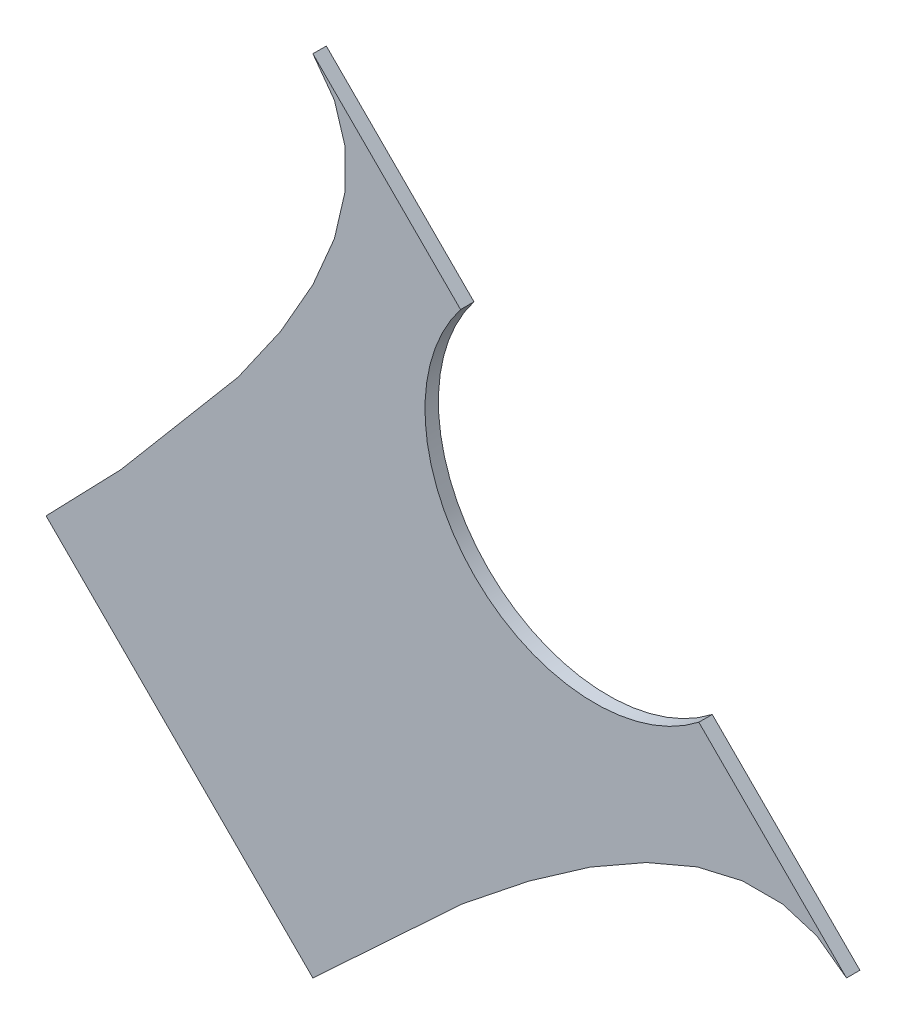
ISO-10303-21;
HEADER;
FILE_DESCRIPTION(('STEP AP214'),'2;1');
FILE_NAME('part.step','',(''),(''),'','','');
FILE_SCHEMA(('AUTOMOTIVE_DESIGN { 1 0 10303 214 1 1 1 1 }'));
ENDSEC;
DATA;
#1=APPLICATION_CONTEXT('core data for automotive mechanical design processes');
#2=APPLICATION_PROTOCOL_DEFINITION('international standard','automotive_design',2000,#1);
#3=PRODUCT_CONTEXT('',#1,'mechanical');
#4=PRODUCT('Part','Part','',(#3));
#5=PRODUCT_RELATED_PRODUCT_CATEGORY('part','',(#4));
#6=PRODUCT_DEFINITION_FORMATION('','',#4);
#7=PRODUCT_DEFINITION_CONTEXT('part definition',#1,'design');
#8=PRODUCT_DEFINITION('design','',#6,#7);
#9=PRODUCT_DEFINITION_SHAPE('','',#8);
#10=(LENGTH_UNIT() NAMED_UNIT(*) SI_UNIT(.MILLI.,.METRE.));
#11=(NAMED_UNIT(*) PLANE_ANGLE_UNIT() SI_UNIT($,.RADIAN.));
#12=(NAMED_UNIT(*) SI_UNIT($,.STERADIAN.) SOLID_ANGLE_UNIT());
#13=UNCERTAINTY_MEASURE_WITH_UNIT(LENGTH_MEASURE(1.E-05),#10,'distance_accuracy_value','');
#14=(GEOMETRIC_REPRESENTATION_CONTEXT(3) GLOBAL_UNCERTAINTY_ASSIGNED_CONTEXT((#13)) GLOBAL_UNIT_ASSIGNED_CONTEXT((#10,
#11,#12)) REPRESENTATION_CONTEXT('',''));
#15=CARTESIAN_POINT('',(0.,0.,0.));
#16=DIRECTION('',(0.,0.,1.));
#17=DIRECTION('',(1.,0.,0.));
#18=AXIS2_PLACEMENT_3D('',#15,#16,#17);
#19=CARTESIAN_POINT('',(46.6570014953613,116.28099822998,0.));
#20=DIRECTION('',(0.707108688823852,0.707104873544097,0.));
#21=DIRECTION('',(0.707104873544097,-0.707108688823852,0.));
#22=AXIS2_PLACEMENT_3D('',#19,#20,#21);
#23=PLANE('',#22);
#24=DIRECTION('',(0.707104873544096,-0.707108688823852,0.));
#25=VECTOR('',#24,1.);
#26=CARTESIAN_POINT('',(46.6570014953613,116.28099822998,0.03556));
#27=LINE('',#26,#25);
#28=CARTESIAN_POINT('',(46.6570014953613,116.28099822998,0.03556));
#29=VERTEX_POINT('',#28);
#30=CARTESIAN_POINT('',(47.3639984130859,115.573997497559,0.03556));
#31=VERTEX_POINT('',#30);
#32=EDGE_CURVE('E11',#29,#31,#27,.T.);
#33=ORIENTED_EDGE('',*,*,#32,.F.);
#34=DIRECTION('',(0.,0.,1.));
#35=VECTOR('',#34,1.);
#36=CARTESIAN_POINT('',(46.6570014953613,116.28099822998,0.));
#37=LINE('',#36,#35);
#38=CARTESIAN_POINT('',(46.6570014953613,116.28099822998,0.));
#39=VERTEX_POINT('',#38);
#40=EDGE_CURVE('E24',#39,#29,#37,.T.);
#41=ORIENTED_EDGE('',*,*,#40,.F.);
#42=DIRECTION('',(0.707104873544096,-0.707108688823852,0.));
#43=VECTOR('',#42,1.);
#44=CARTESIAN_POINT('',(46.6570014953613,116.28099822998,0.));
#45=LINE('',#44,#43);
#46=CARTESIAN_POINT('',(47.3639984130859,115.573997497559,0.));
#47=VERTEX_POINT('',#46);
#48=EDGE_CURVE('E339',#39,#47,#45,.T.);
#49=ORIENTED_EDGE('',*,*,#48,.T.);
#50=DIRECTION('',(0.,0.,1.));
#51=VECTOR('',#50,1.);
#52=CARTESIAN_POINT('',(47.3639984130859,115.573997497559,0.));
#53=LINE('',#52,#51);
#54=EDGE_CURVE('E37',#47,#31,#53,.T.);
#55=ORIENTED_EDGE('',*,*,#54,.T.);
#56=EDGE_LOOP('',(#33,#41,#49,#55));
#57=FACE_BOUND('',#56,.T.);
#58=ADVANCED_FACE('F17',(#57),#23,.F.);
#59=CARTESIAN_POINT('',(46.8549995422363,116.486000061035,0.));
#60=DIRECTION('',(0.71928706010628,-0.694712980419731,0.));
#61=DIRECTION('',(-0.694712980419731,-0.71928706010628,0.));
#62=AXIS2_PLACEMENT_3D('',#59,#60,#61);
#63=PLANE('',#62);
#64=DIRECTION('',(-0.694712980419731,-0.71928706010628,0.));
#65=VECTOR('',#64,1.);
#66=CARTESIAN_POINT('',(46.8549995422363,116.486000061035,0.03556));
#67=LINE('',#66,#65);
#68=CARTESIAN_POINT('',(46.8549995422363,116.486000061035,0.03556));
#69=VERTEX_POINT('',#68);
#70=EDGE_CURVE('E335',#69,#29,#67,.T.);
#71=ORIENTED_EDGE('',*,*,#70,.F.);
#72=DIRECTION('',(0.,0.,1.));
#73=VECTOR('',#72,1.);
#74=CARTESIAN_POINT('',(46.8549995422363,116.486000061035,0.));
#75=LINE('',#74,#73);
#76=CARTESIAN_POINT('',(46.8549995422363,116.486000061035,0.));
#77=VERTEX_POINT('',#76);
#78=EDGE_CURVE('E333',#77,#69,#75,.T.);
#79=ORIENTED_EDGE('',*,*,#78,.F.);
#80=DIRECTION('',(-0.694712980419731,-0.71928706010628,0.));
#81=VECTOR('',#80,1.);
#82=CARTESIAN_POINT('',(46.8549995422363,116.486000061035,0.));
#83=LINE('',#82,#81);
#84=EDGE_CURVE('E331',#77,#39,#83,.T.);
#85=ORIENTED_EDGE('',*,*,#84,.T.);
#86=ORIENTED_EDGE('',*,*,#40,.T.);
#87=EDGE_LOOP('',(#71,#79,#85,#86));
#88=FACE_BOUND('',#87,.T.);
#89=ADVANCED_FACE('F342',(#88),#63,.F.);
#90=CARTESIAN_POINT('',(47.1660003662109,116.853996276855,0.));
#91=DIRECTION('',(0.763775655311876,-0.645481795524022,0.));
#92=DIRECTION('',(-0.645481795524022,-0.763775655311876,0.));
#93=AXIS2_PLACEMENT_3D('',#90,#91,#92);
#94=PLANE('',#93);
#95=DIRECTION('',(-0.645481795524022,-0.763775655311876,0.));
#96=VECTOR('',#95,1.);
#97=CARTESIAN_POINT('',(47.1660003662109,116.853996276855,0.03556));
#98=LINE('',#97,#96);
#99=CARTESIAN_POINT('',(47.1660003662109,116.853996276855,0.03556));
#100=VERTEX_POINT('',#99);
#101=EDGE_CURVE('E328',#100,#69,#98,.T.);
#102=ORIENTED_EDGE('',*,*,#101,.F.);
#103=DIRECTION('',(0.,0.,1.));
#104=VECTOR('',#103,1.);
#105=CARTESIAN_POINT('',(47.1660003662109,116.853996276855,0.));
#106=LINE('',#105,#104);
#107=CARTESIAN_POINT('',(47.1660003662109,116.853996276855,0.));
#108=VERTEX_POINT('',#107);
#109=EDGE_CURVE('E326',#108,#100,#106,.T.);
#110=ORIENTED_EDGE('',*,*,#109,.F.);
#111=DIRECTION('',(-0.645481795524022,-0.763775655311876,0.));
#112=VECTOR('',#111,1.);
#113=CARTESIAN_POINT('',(47.1660003662109,116.853996276855,0.));
#114=LINE('',#113,#112);
#115=EDGE_CURVE('E323',#108,#77,#114,.T.);
#116=ORIENTED_EDGE('',*,*,#115,.T.);
#117=ORIENTED_EDGE('',*,*,#78,.T.);
#118=EDGE_LOOP('',(#102,#110,#116,#117));
#119=FACE_BOUND('',#118,.T.);
#120=ADVANCED_FACE('F345',(#119),#94,.F.);
#121=CARTESIAN_POINT('',(47.2789993286133,117.015998840332,0.));
#122=DIRECTION('',(0.820188914417434,-0.572092776275624,0.));
#123=DIRECTION('',(-0.572092776275624,-0.820188914417434,0.));
#124=AXIS2_PLACEMENT_3D('',#121,#122,#123);
#125=PLANE('',#124);
#126=DIRECTION('',(-0.572092776275624,-0.820188914417434,0.));
#127=VECTOR('',#126,1.);
#128=CARTESIAN_POINT('',(47.2789993286133,117.015998840332,0.03556));
#129=LINE('',#128,#127);
#130=CARTESIAN_POINT('',(47.2789993286133,117.015998840332,0.03556));
#131=VERTEX_POINT('',#130);
#132=EDGE_CURVE('E320',#131,#100,#129,.T.);
#133=ORIENTED_EDGE('',*,*,#132,.F.);
#134=DIRECTION('',(0.,0.,1.));
#135=VECTOR('',#134,1.);
#136=CARTESIAN_POINT('',(47.2789993286133,117.015998840332,0.));
#137=LINE('',#136,#135);
#138=CARTESIAN_POINT('',(47.2789993286133,117.015998840332,0.));
#139=VERTEX_POINT('',#138);
#140=EDGE_CURVE('E318',#139,#131,#137,.T.);
#141=ORIENTED_EDGE('',*,*,#140,.F.);
#142=DIRECTION('',(-0.572092776275624,-0.820188914417434,0.));
#143=VECTOR('',#142,1.);
#144=CARTESIAN_POINT('',(47.2789993286133,117.015998840332,0.));
#145=LINE('',#144,#143);
#146=EDGE_CURVE('E315',#139,#108,#145,.T.);
#147=ORIENTED_EDGE('',*,*,#146,.T.);
#148=ORIENTED_EDGE('',*,*,#109,.T.);
#149=EDGE_LOOP('',(#133,#141,#147,#148));
#150=FACE_BOUND('',#149,.T.);
#151=ADVANCED_FACE('F350',(#150),#125,.F.);
#152=CARTESIAN_POINT('',(47.3639984130859,117.165000915527,0.));
#153=DIRECTION('',(0.868606923465397,-0.495501778511418,0.));
#154=DIRECTION('',(-0.495501778511418,-0.868606923465397,0.));
#155=AXIS2_PLACEMENT_3D('',#152,#153,#154);
#156=PLANE('',#155);
#157=DIRECTION('',(-0.495501778511418,-0.868606923465397,0.));
#158=VECTOR('',#157,1.);
#159=CARTESIAN_POINT('',(47.3639984130859,117.165000915527,0.03556));
#160=LINE('',#159,#158);
#161=CARTESIAN_POINT('',(47.3639984130859,117.165000915527,0.03556));
#162=VERTEX_POINT('',#161);
#163=EDGE_CURVE('E312',#162,#131,#160,.T.);
#164=ORIENTED_EDGE('',*,*,#163,.F.);
#165=DIRECTION('',(0.,0.,1.));
#166=VECTOR('',#165,1.);
#167=CARTESIAN_POINT('',(47.3639984130859,117.165000915527,0.));
#168=LINE('',#167,#166);
#169=CARTESIAN_POINT('',(47.3639984130859,117.165000915527,0.));
#170=VERTEX_POINT('',#169);
#171=EDGE_CURVE('E310',#170,#162,#168,.T.);
#172=ORIENTED_EDGE('',*,*,#171,.F.);
#173=DIRECTION('',(-0.495501778511418,-0.868606923465397,0.));
#174=VECTOR('',#173,1.);
#175=CARTESIAN_POINT('',(47.3639984130859,117.165000915527,0.));
#176=LINE('',#175,#174);
#177=EDGE_CURVE('E307',#170,#139,#176,.T.);
#178=ORIENTED_EDGE('',*,*,#177,.T.);
#179=ORIENTED_EDGE('',*,*,#140,.T.);
#180=EDGE_LOOP('',(#164,#172,#178,#179));
#181=FACE_BOUND('',#180,.T.);
#182=ADVANCED_FACE('F353',(#181),#156,.F.);
#183=CARTESIAN_POINT('',(47.4210014343262,117.299003601074,0.));
#184=DIRECTION('',(0.920202622375273,-0.391442376057666,0.));
#185=DIRECTION('',(-0.391442376057666,-0.920202622375273,0.));
#186=AXIS2_PLACEMENT_3D('',#183,#184,#185);
#187=PLANE('',#186);
#188=DIRECTION('',(-0.391442376057666,-0.920202622375273,0.));
#189=VECTOR('',#188,1.);
#190=CARTESIAN_POINT('',(47.4210014343262,117.299003601074,0.03556));
#191=LINE('',#190,#189);
#192=CARTESIAN_POINT('',(47.4210014343262,117.299003601074,0.03556));
#193=VERTEX_POINT('',#192);
#194=EDGE_CURVE('E304',#193,#162,#191,.T.);
#195=ORIENTED_EDGE('',*,*,#194,.F.);
#196=DIRECTION('',(0.,0.,1.));
#197=VECTOR('',#196,1.);
#198=CARTESIAN_POINT('',(47.4210014343262,117.299003601074,0.));
#199=LINE('',#198,#197);
#200=CARTESIAN_POINT('',(47.4210014343262,117.299003601074,0.));
#201=VERTEX_POINT('',#200);
#202=EDGE_CURVE('E302',#201,#193,#199,.T.);
#203=ORIENTED_EDGE('',*,*,#202,.F.);
#204=DIRECTION('',(-0.391442376057666,-0.920202622375273,0.));
#205=VECTOR('',#204,1.);
#206=CARTESIAN_POINT('',(47.4210014343262,117.299003601074,0.));
#207=LINE('',#206,#205);
#208=EDGE_CURVE('E299',#201,#170,#207,.T.);
#209=ORIENTED_EDGE('',*,*,#208,.T.);
#210=ORIENTED_EDGE('',*,*,#171,.T.);
#211=EDGE_LOOP('',(#195,#203,#209,#210));
#212=FACE_BOUND('',#211,.T.);
#213=ADVANCED_FACE('F358',(#212),#187,.F.);
#214=CARTESIAN_POINT('',(47.4490013122559,117.419998168945,0.));
#215=DIRECTION('',(0.974253308207898,-0.225456185202282,0.));
#216=DIRECTION('',(-0.225456185202282,-0.974253308207898,0.));
#217=AXIS2_PLACEMENT_3D('',#214,#215,#216);
#218=PLANE('',#217);
#219=DIRECTION('',(-0.225456185202282,-0.974253308207898,0.));
#220=VECTOR('',#219,1.);
#221=CARTESIAN_POINT('',(47.4490013122559,117.419998168945,0.03556));
#222=LINE('',#221,#220);
#223=CARTESIAN_POINT('',(47.4490013122559,117.419998168945,0.03556));
#224=VERTEX_POINT('',#223);
#225=EDGE_CURVE('E296',#224,#193,#222,.T.);
#226=ORIENTED_EDGE('',*,*,#225,.F.);
#227=DIRECTION('',(0.,0.,1.));
#228=VECTOR('',#227,1.);
#229=CARTESIAN_POINT('',(47.4490013122559,117.419998168945,0.));
#230=LINE('',#229,#228);
#231=CARTESIAN_POINT('',(47.4490013122559,117.419998168945,0.));
#232=VERTEX_POINT('',#231);
#233=EDGE_CURVE('E294',#232,#224,#230,.T.);
#234=ORIENTED_EDGE('',*,*,#233,.F.);
#235=DIRECTION('',(-0.225456185202282,-0.974253308207898,0.));
#236=VECTOR('',#235,1.);
#237=CARTESIAN_POINT('',(47.4490013122559,117.419998168945,0.));
#238=LINE('',#237,#236);
#239=EDGE_CURVE('E291',#232,#201,#238,.T.);
#240=ORIENTED_EDGE('',*,*,#239,.T.);
#241=ORIENTED_EDGE('',*,*,#202,.T.);
#242=EDGE_LOOP('',(#226,#234,#240,#241));
#243=FACE_BOUND('',#242,.T.);
#244=ADVANCED_FACE('F361',(#243),#218,.F.);
#245=CARTESIAN_POINT('',(47.4490013122559,117.526000976562,0.));
#246=DIRECTION('',(1.,0.,0.));
#247=DIRECTION('',(0.,-1.,0.));
#248=AXIS2_PLACEMENT_3D('',#245,#246,#247);
#249=PLANE('',#248);
#250=DIRECTION('',(0.,-1.,0.));
#251=VECTOR('',#250,1.);
#252=CARTESIAN_POINT('',(47.4490013122559,117.526000976562,0.03556));
#253=LINE('',#252,#251);
#254=CARTESIAN_POINT('',(47.4490013122559,117.526000976562,0.03556));
#255=VERTEX_POINT('',#254);
#256=EDGE_CURVE('E288',#255,#224,#253,.T.);
#257=ORIENTED_EDGE('',*,*,#256,.F.);
#258=DIRECTION('',(0.,0.,1.));
#259=VECTOR('',#258,1.);
#260=CARTESIAN_POINT('',(47.4490013122559,117.526000976562,0.));
#261=LINE('',#260,#259);
#262=CARTESIAN_POINT('',(47.4490013122559,117.526000976562,0.));
#263=VERTEX_POINT('',#262);
#264=EDGE_CURVE('E286',#263,#255,#261,.T.);
#265=ORIENTED_EDGE('',*,*,#264,.F.);
#266=DIRECTION('',(0.,-1.,0.));
#267=VECTOR('',#266,1.);
#268=CARTESIAN_POINT('',(47.4490013122559,117.526000976562,0.));
#269=LINE('',#268,#267);
#270=EDGE_CURVE('E283',#263,#232,#269,.T.);
#271=ORIENTED_EDGE('',*,*,#270,.T.);
#272=ORIENTED_EDGE('',*,*,#233,.T.);
#273=EDGE_LOOP('',(#257,#265,#271,#272));
#274=FACE_BOUND('',#273,.T.);
#275=ADVANCED_FACE('F366',(#274),#249,.F.);
#276=CARTESIAN_POINT('',(47.4210014343262,117.616996765137,0.));
#277=DIRECTION('',(0.955775543338726,0.294097111096934,0.));
#278=DIRECTION('',(0.294097111096934,-0.955775543338726,0.));
#279=AXIS2_PLACEMENT_3D('',#276,#277,#278);
#280=PLANE('',#279);
#281=DIRECTION('',(0.294097111096934,-0.955775543338726,0.));
#282=VECTOR('',#281,1.);
#283=CARTESIAN_POINT('',(47.4210014343262,117.616996765137,0.03556));
#284=LINE('',#283,#282);
#285=CARTESIAN_POINT('',(47.4210014343262,117.616996765137,0.03556));
#286=VERTEX_POINT('',#285);
#287=EDGE_CURVE('E280',#286,#255,#284,.T.);
#288=ORIENTED_EDGE('',*,*,#287,.F.);
#289=DIRECTION('',(0.,0.,1.));
#290=VECTOR('',#289,1.);
#291=CARTESIAN_POINT('',(47.4210014343262,117.616996765137,0.));
#292=LINE('',#291,#290);
#293=CARTESIAN_POINT('',(47.4210014343262,117.616996765137,0.));
#294=VERTEX_POINT('',#293);
#295=EDGE_CURVE('E278',#294,#286,#292,.T.);
#296=ORIENTED_EDGE('',*,*,#295,.F.);
#297=DIRECTION('',(0.294097111096934,-0.955775543338726,0.));
#298=VECTOR('',#297,1.);
#299=CARTESIAN_POINT('',(47.4210014343262,117.616996765137,0.));
#300=LINE('',#299,#298);
#301=EDGE_CURVE('E275',#294,#263,#300,.T.);
#302=ORIENTED_EDGE('',*,*,#301,.T.);
#303=ORIENTED_EDGE('',*,*,#264,.T.);
#304=EDGE_LOOP('',(#288,#296,#302,#303));
#305=FACE_BOUND('',#304,.T.);
#306=ADVANCED_FACE('F369',(#305),#280,.F.);
#307=CARTESIAN_POINT('',(47.3639984130859,117.694999694824,0.));
#308=DIRECTION('',(0.807386781564813,0.590022529192244,0.));
#309=DIRECTION('',(0.590022529192244,-0.807386781564813,0.));
#310=AXIS2_PLACEMENT_3D('',#307,#308,#309);
#311=PLANE('',#310);
#312=DIRECTION('',(0.590022529192244,-0.807386781564813,0.));
#313=VECTOR('',#312,1.);
#314=CARTESIAN_POINT('',(47.3639984130859,117.694999694824,0.03556));
#315=LINE('',#314,#313);
#316=CARTESIAN_POINT('',(47.3639984130859,117.694999694824,0.03556));
#317=VERTEX_POINT('',#316);
#318=EDGE_CURVE('E272',#317,#286,#315,.T.);
#319=ORIENTED_EDGE('',*,*,#318,.F.);
#320=DIRECTION('',(0.,0.,1.));
#321=VECTOR('',#320,1.);
#322=CARTESIAN_POINT('',(47.3639984130859,117.694999694824,0.));
#323=LINE('',#322,#321);
#324=CARTESIAN_POINT('',(47.3639984130859,117.694999694824,0.));
#325=VERTEX_POINT('',#324);
#326=EDGE_CURVE('E270',#325,#317,#323,.T.);
#327=ORIENTED_EDGE('',*,*,#326,.F.);
#328=DIRECTION('',(0.590022529192244,-0.807386781564813,0.));
#329=VECTOR('',#328,1.);
#330=CARTESIAN_POINT('',(47.3639984130859,117.694999694824,0.));
#331=LINE('',#330,#329);
#332=EDGE_CURVE('E267',#325,#294,#331,.T.);
#333=ORIENTED_EDGE('',*,*,#332,.T.);
#334=ORIENTED_EDGE('',*,*,#295,.T.);
#335=EDGE_LOOP('',(#319,#327,#333,#334));
#336=FACE_BOUND('',#335,.T.);
#337=ADVANCED_FACE('F374',(#336),#311,.F.);
#338=CARTESIAN_POINT('',(47.7553232454057,117.303674862504,0.));
#339=DIRECTION('',(-0.707106781186548,-0.707106781186548,0.));
#340=DIRECTION('',(-0.707106781186548,0.707106781186548,0.));
#341=AXIS2_PLACEMENT_3D('',#338,#339,#340);
#342=PLANE('',#341);
#343=DIRECTION('',(-0.707106781186548,0.707106781186548,0.));
#344=VECTOR('',#343,1.);
#345=CARTESIAN_POINT('',(48.7779998779297,116.28099822998,0.03556));
#346=LINE('',#345,#344);
#347=CARTESIAN_POINT('',(47.7553232454057,117.303674862504,0.03556));
#348=VERTEX_POINT('',#347);
#349=EDGE_CURVE('E264',#348,#317,#346,.T.);
#350=ORIENTED_EDGE('',*,*,#349,.F.);
#351=DIRECTION('',(0.,0.,1.));
#352=VECTOR('',#351,1.);
#353=CARTESIAN_POINT('',(47.7553232454057,117.303674862504,0.));
#354=LINE('',#353,#352);
#355=CARTESIAN_POINT('',(47.7553232454057,117.303674862504,0.));
#356=VERTEX_POINT('',#355);
#357=EDGE_CURVE('E262',#356,#348,#354,.T.);
#358=ORIENTED_EDGE('',*,*,#357,.F.);
#359=DIRECTION('',(-0.707106781186548,0.707106781186548,0.));
#360=VECTOR('',#359,1.);
#361=CARTESIAN_POINT('',(48.7779998779297,116.28099822998,0.));
#362=LINE('',#361,#360);
#363=EDGE_CURVE('E259',#356,#325,#362,.T.);
#364=ORIENTED_EDGE('',*,*,#363,.T.);
#365=ORIENTED_EDGE('',*,*,#326,.T.);
#366=EDGE_LOOP('',(#350,#358,#364,#365));
#367=FACE_BOUND('',#366,.T.);
#368=ADVANCED_FACE('F377',(#367),#342,.F.);
#369=CARTESIAN_POINT('',(48.1110036,117.0280108,0.));
#370=DIRECTION('',(0.,0.,-1.));
#371=DIRECTION('',(1.,0.,0.));
#372=AXIS2_PLACEMENT_3D('',#369,#370,#371);
#373=CYLINDRICAL_SURFACE('',#372,0.4499991);
#374=ORIENTED_EDGE('',*,*,#357,.T.);
#375=CARTESIAN_POINT('',(48.1110036,117.0280108,0.03556));
#376=DIRECTION('',(0.,0.,1.));
#377=DIRECTION('',(1.,0.,0.));
#378=AXIS2_PLACEMENT_3D('',#375,#376,#377);
#379=CIRCLE('',#378,0.4499991);
#380=CARTESIAN_POINT('',(48.3866676625045,116.672330445406,0.03556));
#381=VERTEX_POINT('',#380);
#382=EDGE_CURVE('E256',#348,#381,#379,.T.);
#383=ORIENTED_EDGE('',*,*,#382,.T.);
#384=DIRECTION('',(0.,0.,1.));
#385=VECTOR('',#384,1.);
#386=CARTESIAN_POINT('',(48.3866676625045,116.672330445406,0.));
#387=LINE('',#386,#385);
#388=CARTESIAN_POINT('',(48.3866676625045,116.672330445406,0.));
#389=VERTEX_POINT('',#388);
#390=EDGE_CURVE('E254',#389,#381,#387,.T.);
#391=ORIENTED_EDGE('',*,*,#390,.F.);
#392=CARTESIAN_POINT('',(48.1110036,117.0280108,0.));
#393=DIRECTION('',(0.,0.,1.));
#394=DIRECTION('',(1.,0.,0.));
#395=AXIS2_PLACEMENT_3D('',#392,#393,#394);
#396=CIRCLE('',#395,0.4499991);
#397=EDGE_CURVE('E251',#356,#389,#396,.T.);
#398=ORIENTED_EDGE('',*,*,#397,.F.);
#399=EDGE_LOOP('',(#374,#383,#391,#398));
#400=FACE_BOUND('',#399,.T.);
#401=ADVANCED_FACE('F383',(#400),#373,.F.);
#402=CARTESIAN_POINT('',(48.7779998779297,116.28099822998,0.));
#403=DIRECTION('',(-0.707106781186548,-0.707106781186548,0.));
#404=DIRECTION('',(-0.707106781186548,0.707106781186548,0.));
#405=AXIS2_PLACEMENT_3D('',#402,#403,#404);
#406=PLANE('',#405);
#407=DIRECTION('',(-0.707106781186548,0.707106781186548,0.));
#408=VECTOR('',#407,1.);
#409=CARTESIAN_POINT('',(48.7779998779297,116.28099822998,0.03556));
#410=LINE('',#409,#408);
#411=CARTESIAN_POINT('',(48.7779998779297,116.28099822998,0.03556));
#412=VERTEX_POINT('',#411);
#413=EDGE_CURVE('E248',#412,#381,#410,.T.);
#414=ORIENTED_EDGE('',*,*,#413,.F.);
#415=DIRECTION('',(0.,0.,1.));
#416=VECTOR('',#415,1.);
#417=CARTESIAN_POINT('',(48.7779998779297,116.28099822998,0.));
#418=LINE('',#417,#416);
#419=CARTESIAN_POINT('',(48.7779998779297,116.28099822998,0.));
#420=VERTEX_POINT('',#419);
#421=EDGE_CURVE('E246',#420,#412,#418,.T.);
#422=ORIENTED_EDGE('',*,*,#421,.F.);
#423=EDGE_CURVE('E245',#420,#389,#362,.T.);
#424=ORIENTED_EDGE('',*,*,#423,.T.);
#425=ORIENTED_EDGE('',*,*,#390,.T.);
#426=EDGE_LOOP('',(#414,#422,#424,#425));
#427=FACE_BOUND('',#426,.T.);
#428=ADVANCED_FACE('F386',(#427),#406,.F.);
#429=CARTESIAN_POINT('',(48.7000007629395,116.337997436523,0.));
#430=DIRECTION('',(0.59001559930959,0.807391845742416,0.));
#431=DIRECTION('',(0.807391845742416,-0.59001559930959,0.));
#432=AXIS2_PLACEMENT_3D('',#429,#430,#431);
#433=PLANE('',#432);
#434=DIRECTION('',(0.807391845742416,-0.59001559930959,0.));
#435=VECTOR('',#434,1.);
#436=CARTESIAN_POINT('',(48.7000007629395,116.337997436523,0.03556));
#437=LINE('',#436,#435);
#438=CARTESIAN_POINT('',(48.7000007629395,116.337997436523,0.03556));
#439=VERTEX_POINT('',#438);
#440=EDGE_CURVE('E242',#439,#412,#437,.T.);
#441=ORIENTED_EDGE('',*,*,#440,.F.);
#442=DIRECTION('',(0.,0.,1.));
#443=VECTOR('',#442,1.);
#444=CARTESIAN_POINT('',(48.7000007629395,116.337997436523,0.));
#445=LINE('',#444,#443);
#446=CARTESIAN_POINT('',(48.7000007629395,116.337997436523,0.));
#447=VERTEX_POINT('',#446);
#448=EDGE_CURVE('E240',#447,#439,#445,.T.);
#449=ORIENTED_EDGE('',*,*,#448,.F.);
#450=DIRECTION('',(0.807391845742416,-0.59001559930959,0.));
#451=VECTOR('',#450,1.);
#452=CARTESIAN_POINT('',(48.7000007629395,116.337997436523,0.));
#453=LINE('',#452,#451);
#454=EDGE_CURVE('E237',#447,#420,#453,.T.);
#455=ORIENTED_EDGE('',*,*,#454,.T.);
#456=ORIENTED_EDGE('',*,*,#421,.T.);
#457=EDGE_LOOP('',(#441,#449,#455,#456));
#458=FACE_BOUND('',#457,.T.);
#459=ADVANCED_FACE('F391',(#458),#433,.F.);
#460=CARTESIAN_POINT('',(48.609001159668,116.365997314453,0.));
#461=DIRECTION('',(0.294085848837523,0.95577900872195,0.));
#462=DIRECTION('',(0.95577900872195,-0.294085848837523,0.));
#463=AXIS2_PLACEMENT_3D('',#460,#461,#462);
#464=PLANE('',#463);
#465=DIRECTION('',(0.95577900872195,-0.294085848837523,0.));
#466=VECTOR('',#465,1.);
#467=CARTESIAN_POINT('',(48.609001159668,116.365997314453,0.03556));
#468=LINE('',#467,#466);
#469=CARTESIAN_POINT('',(48.609001159668,116.365997314453,0.03556));
#470=VERTEX_POINT('',#469);
#471=EDGE_CURVE('E234',#470,#439,#468,.T.);
#472=ORIENTED_EDGE('',*,*,#471,.F.);
#473=DIRECTION('',(0.,0.,1.));
#474=VECTOR('',#473,1.);
#475=CARTESIAN_POINT('',(48.609001159668,116.365997314453,0.));
#476=LINE('',#475,#474);
#477=CARTESIAN_POINT('',(48.609001159668,116.365997314453,0.));
#478=VERTEX_POINT('',#477);
#479=EDGE_CURVE('E232',#478,#470,#476,.T.);
#480=ORIENTED_EDGE('',*,*,#479,.F.);
#481=DIRECTION('',(0.95577900872195,-0.294085848837523,0.));
#482=VECTOR('',#481,1.);
#483=CARTESIAN_POINT('',(48.609001159668,116.365997314453,0.));
#484=LINE('',#483,#482);
#485=EDGE_CURVE('E229',#478,#447,#484,.T.);
#486=ORIENTED_EDGE('',*,*,#485,.T.);
#487=ORIENTED_EDGE('',*,*,#448,.T.);
#488=EDGE_LOOP('',(#472,#480,#486,#487));
#489=FACE_BOUND('',#488,.T.);
#490=ADVANCED_FACE('F394',(#489),#464,.F.);
#491=CARTESIAN_POINT('',(48.5019989013672,116.365997314453,0.));
#492=DIRECTION('',(0.,1.,0.));
#493=DIRECTION('',(1.,0.,0.));
#494=AXIS2_PLACEMENT_3D('',#491,#492,#493);
#495=PLANE('',#494);
#496=DIRECTION('',(1.,0.,0.));
#497=VECTOR('',#496,1.);
#498=CARTESIAN_POINT('',(48.5019989013672,116.365997314453,0.03556));
#499=LINE('',#498,#497);
#500=CARTESIAN_POINT('',(48.5019989013672,116.365997314453,0.03556));
#501=VERTEX_POINT('',#500);
#502=EDGE_CURVE('E226',#501,#470,#499,.T.);
#503=ORIENTED_EDGE('',*,*,#502,.F.);
#504=DIRECTION('',(0.,0.,1.));
#505=VECTOR('',#504,1.);
#506=CARTESIAN_POINT('',(48.5019989013672,116.365997314453,0.));
#507=LINE('',#506,#505);
#508=CARTESIAN_POINT('',(48.5019989013672,116.365997314453,0.));
#509=VERTEX_POINT('',#508);
#510=EDGE_CURVE('E224',#509,#501,#507,.T.);
#511=ORIENTED_EDGE('',*,*,#510,.F.);
#512=DIRECTION('',(1.,0.,0.));
#513=VECTOR('',#512,1.);
#514=CARTESIAN_POINT('',(48.5019989013672,116.365997314453,0.));
#515=LINE('',#514,#513);
#516=EDGE_CURVE('E221',#509,#478,#515,.T.);
#517=ORIENTED_EDGE('',*,*,#516,.T.);
#518=ORIENTED_EDGE('',*,*,#479,.T.);
#519=EDGE_LOOP('',(#503,#511,#517,#518));
#520=FACE_BOUND('',#519,.T.);
#521=ADVANCED_FACE('F399',(#520),#495,.F.);
#522=CARTESIAN_POINT('',(48.3819999694824,116.337997436523,0.));
#523=DIRECTION('',(-0.227230594252667,0.973840981390483,0.));
#524=DIRECTION('',(0.973840981390483,0.227230594252667,0.));
#525=AXIS2_PLACEMENT_3D('',#522,#523,#524);
#526=PLANE('',#525);
#527=DIRECTION('',(0.973840981390483,0.227230594252667,0.));
#528=VECTOR('',#527,1.);
#529=CARTESIAN_POINT('',(48.3819999694824,116.337997436523,0.03556));
#530=LINE('',#529,#528);
#531=CARTESIAN_POINT('',(48.3819999694824,116.337997436523,0.03556));
#532=VERTEX_POINT('',#531);
#533=EDGE_CURVE('E218',#532,#501,#530,.T.);
#534=ORIENTED_EDGE('',*,*,#533,.F.);
#535=DIRECTION('',(0.,0.,1.));
#536=VECTOR('',#535,1.);
#537=CARTESIAN_POINT('',(48.3819999694824,116.337997436523,0.));
#538=LINE('',#537,#536);
#539=CARTESIAN_POINT('',(48.3819999694824,116.337997436523,0.));
#540=VERTEX_POINT('',#539);
#541=EDGE_CURVE('E216',#540,#532,#538,.T.);
#542=ORIENTED_EDGE('',*,*,#541,.F.);
#543=DIRECTION('',(0.973840981390483,0.227230594252667,0.));
#544=VECTOR('',#543,1.);
#545=CARTESIAN_POINT('',(48.3819999694824,116.337997436523,0.));
#546=LINE('',#545,#544);
#547=EDGE_CURVE('E213',#540,#509,#546,.T.);
#548=ORIENTED_EDGE('',*,*,#547,.T.);
#549=ORIENTED_EDGE('',*,*,#510,.T.);
#550=EDGE_LOOP('',(#534,#542,#548,#549));
#551=FACE_BOUND('',#550,.T.);
#552=ADVANCED_FACE('F402',(#551),#526,.F.);
#553=CARTESIAN_POINT('',(48.2480010986328,116.28099822998,0.));
#554=DIRECTION('',(-0.391429629629373,0.920208044437893,0.));
#555=DIRECTION('',(0.920208044437893,0.391429629629373,0.));
#556=AXIS2_PLACEMENT_3D('',#553,#554,#555);
#557=PLANE('',#556);
#558=DIRECTION('',(0.920208044437893,0.391429629629373,0.));
#559=VECTOR('',#558,1.);
#560=CARTESIAN_POINT('',(48.2480010986328,116.28099822998,0.03556));
#561=LINE('',#560,#559);
#562=CARTESIAN_POINT('',(48.2480010986328,116.28099822998,0.03556));
#563=VERTEX_POINT('',#562);
#564=EDGE_CURVE('E210',#563,#532,#561,.T.);
#565=ORIENTED_EDGE('',*,*,#564,.F.);
#566=DIRECTION('',(0.,0.,1.));
#567=VECTOR('',#566,1.);
#568=CARTESIAN_POINT('',(48.2480010986328,116.28099822998,0.));
#569=LINE('',#568,#567);
#570=CARTESIAN_POINT('',(48.2480010986328,116.28099822998,0.));
#571=VERTEX_POINT('',#570);
#572=EDGE_CURVE('E208',#571,#563,#569,.T.);
#573=ORIENTED_EDGE('',*,*,#572,.F.);
#574=DIRECTION('',(0.920208044437893,0.391429629629373,0.));
#575=VECTOR('',#574,1.);
#576=CARTESIAN_POINT('',(48.2480010986328,116.28099822998,0.));
#577=LINE('',#576,#575);
#578=EDGE_CURVE('E205',#571,#540,#577,.T.);
#579=ORIENTED_EDGE('',*,*,#578,.T.);
#580=ORIENTED_EDGE('',*,*,#541,.T.);
#581=EDGE_LOOP('',(#565,#573,#579,#580));
#582=FACE_BOUND('',#581,.T.);
#583=ADVANCED_FACE('F406',(#582),#557,.F.);
#584=CARTESIAN_POINT('',(48.0989990234375,116.195999145508,0.));
#585=DIRECTION('',(-0.495501778511418,0.868606923465397,0.));
#586=DIRECTION('',(0.868606923465397,0.495501778511418,0.));
#587=AXIS2_PLACEMENT_3D('',#584,#585,#586);
#588=PLANE('',#587);
#589=DIRECTION('',(0.868606923465397,0.495501778511418,0.));
#590=VECTOR('',#589,1.);
#591=CARTESIAN_POINT('',(48.0989990234375,116.195999145508,0.03556));
#592=LINE('',#591,#590);
#593=CARTESIAN_POINT('',(48.0989990234375,116.195999145508,0.03556));
#594=VERTEX_POINT('',#593);
#595=EDGE_CURVE('E202',#594,#563,#592,.T.);
#596=ORIENTED_EDGE('',*,*,#595,.F.);
#597=DIRECTION('',(0.,0.,1.));
#598=VECTOR('',#597,1.);
#599=CARTESIAN_POINT('',(48.0989990234375,116.195999145508,0.));
#600=LINE('',#599,#598);
#601=CARTESIAN_POINT('',(48.0989990234375,116.195999145508,0.));
#602=VERTEX_POINT('',#601);
#603=EDGE_CURVE('E200',#602,#594,#600,.T.);
#604=ORIENTED_EDGE('',*,*,#603,.F.);
#605=DIRECTION('',(0.868606923465397,0.495501778511418,0.));
#606=VECTOR('',#605,1.);
#607=CARTESIAN_POINT('',(48.0989990234375,116.195999145508,0.));
#608=LINE('',#607,#606);
#609=EDGE_CURVE('E197',#602,#571,#608,.T.);
#610=ORIENTED_EDGE('',*,*,#609,.T.);
#611=ORIENTED_EDGE('',*,*,#572,.T.);
#612=EDGE_LOOP('',(#596,#604,#610,#611));
#613=FACE_BOUND('',#612,.T.);
#614=ADVANCED_FACE('F409',(#613),#588,.F.);
#615=CARTESIAN_POINT('',(47.9370002746582,116.083000183105,0.));
#616=DIRECTION('',(-0.572101838559274,0.820182593278532,0.));
#617=DIRECTION('',(0.820182593278532,0.572101838559274,0.));
#618=AXIS2_PLACEMENT_3D('',#615,#616,#617);
#619=PLANE('',#618);
#620=DIRECTION('',(0.820182593278532,0.572101838559274,0.));
#621=VECTOR('',#620,1.);
#622=CARTESIAN_POINT('',(47.9370002746582,116.083000183105,0.03556));
#623=LINE('',#622,#621);
#624=CARTESIAN_POINT('',(47.9370002746582,116.083000183105,0.03556));
#625=VERTEX_POINT('',#624);
#626=EDGE_CURVE('E194',#625,#594,#623,.T.);
#627=ORIENTED_EDGE('',*,*,#626,.F.);
#628=DIRECTION('',(0.,0.,1.));
#629=VECTOR('',#628,1.);
#630=CARTESIAN_POINT('',(47.9370002746582,116.083000183105,0.));
#631=LINE('',#630,#629);
#632=CARTESIAN_POINT('',(47.9370002746582,116.083000183105,0.));
#633=VERTEX_POINT('',#632);
#634=EDGE_CURVE('E192',#633,#625,#631,.T.);
#635=ORIENTED_EDGE('',*,*,#634,.F.);
#636=DIRECTION('',(0.820182593278532,0.572101838559274,0.));
#637=VECTOR('',#636,1.);
#638=CARTESIAN_POINT('',(47.9370002746582,116.083000183105,0.));
#639=LINE('',#638,#637);
#640=EDGE_CURVE('E183',#633,#602,#639,.T.);
#641=ORIENTED_EDGE('',*,*,#640,.T.);
#642=ORIENTED_EDGE('',*,*,#603,.T.);
#643=EDGE_LOOP('',(#627,#635,#641,#642));
#644=FACE_BOUND('',#643,.T.);
#645=ADVANCED_FACE('F412',(#644),#619,.F.);
#646=CARTESIAN_POINT('',(47.7599983215332,115.942001342773,0.));
#647=DIRECTION('',(-0.623069665247234,0.782166345637998,0.));
#648=DIRECTION('',(0.782166345637998,0.623069665247234,0.));
#649=AXIS2_PLACEMENT_3D('',#646,#647,#648);
#650=PLANE('',#649);
#651=DIRECTION('',(0.782166345637998,0.623069665247234,0.));
#652=VECTOR('',#651,1.);
#653=CARTESIAN_POINT('',(47.7599983215332,115.942001342773,0.03556));
#654=LINE('',#653,#652);
#655=CARTESIAN_POINT('',(47.7599983215332,115.942001342773,0.03556));
#656=VERTEX_POINT('',#655);
#657=EDGE_CURVE('E169',#656,#625,#654,.T.);
#658=ORIENTED_EDGE('',*,*,#657,.F.);
#659=DIRECTION('',(0.,0.,1.));
#660=VECTOR('',#659,1.);
#661=CARTESIAN_POINT('',(47.7599983215332,115.942001342773,0.));
#662=LINE('',#661,#660);
#663=CARTESIAN_POINT('',(47.7599983215332,115.942001342773,0.));
#664=VERTEX_POINT('',#663);
#665=EDGE_CURVE('E164',#664,#656,#662,.T.);
#666=ORIENTED_EDGE('',*,*,#665,.F.);
#667=DIRECTION('',(0.782166345637998,0.623069665247234,0.));
#668=VECTOR('',#667,1.);
#669=CARTESIAN_POINT('',(47.7599983215332,115.942001342773,0.));
#670=LINE('',#669,#668);
#671=EDGE_CURVE('E167',#664,#633,#670,.T.);
#672=ORIENTED_EDGE('',*,*,#671,.T.);
#673=ORIENTED_EDGE('',*,*,#634,.T.);
#674=EDGE_LOOP('',(#658,#666,#672,#673));
#675=FACE_BOUND('',#674,.T.);
#676=ADVANCED_FACE('F166',(#675),#650,.F.);
#677=CARTESIAN_POINT('',(47.3639984130859,115.573997497559,0.));
#678=DIRECTION('',(-0.680738758032471,0.732526274827333,0.));
#679=DIRECTION('',(0.732526274827333,0.680738758032471,0.));
#680=AXIS2_PLACEMENT_3D('',#677,#678,#679);
#681=PLANE('',#680);
#682=DIRECTION('',(0.732526274827333,0.680738758032471,0.));
#683=VECTOR('',#682,1.);
#684=CARTESIAN_POINT('',(47.3639984130859,115.573997497559,0.03556));
#685=LINE('',#684,#683);
#686=EDGE_CURVE('E184',#31,#656,#685,.T.);
#687=ORIENTED_EDGE('',*,*,#686,.F.);
#688=ORIENTED_EDGE('',*,*,#54,.F.);
#689=DIRECTION('',(0.732526274827333,0.680738758032471,0.));
#690=VECTOR('',#689,1.);
#691=CARTESIAN_POINT('',(47.3639984130859,115.573997497559,0.));
#692=LINE('',#691,#690);
#693=EDGE_CURVE('E180',#47,#664,#692,.T.);
#694=ORIENTED_EDGE('',*,*,#693,.T.);
#695=ORIENTED_EDGE('',*,*,#665,.T.);
#696=EDGE_LOOP('',(#687,#688,#694,#695));
#697=FACE_BOUND('',#696,.T.);
#698=ADVANCED_FACE('F186',(#697),#681,.F.);
#699=CARTESIAN_POINT('',(47.3639984130859,115.573997497559,0.));
#700=DIRECTION('',(0.,0.,1.));
#701=DIRECTION('',(1.,0.,0.));
#702=AXIS2_PLACEMENT_3D('',#699,#700,#701);
#703=PLANE('',#702);
#704=ORIENTED_EDGE('',*,*,#693,.F.);
#705=ORIENTED_EDGE('',*,*,#48,.F.);
#706=ORIENTED_EDGE('',*,*,#84,.F.);
#707=ORIENTED_EDGE('',*,*,#115,.F.);
#708=ORIENTED_EDGE('',*,*,#146,.F.);
#709=ORIENTED_EDGE('',*,*,#177,.F.);
#710=ORIENTED_EDGE('',*,*,#208,.F.);
#711=ORIENTED_EDGE('',*,*,#239,.F.);
#712=ORIENTED_EDGE('',*,*,#270,.F.);
#713=ORIENTED_EDGE('',*,*,#301,.F.);
#714=ORIENTED_EDGE('',*,*,#332,.F.);
#715=ORIENTED_EDGE('',*,*,#363,.F.);
#716=ORIENTED_EDGE('',*,*,#397,.T.);
#717=ORIENTED_EDGE('',*,*,#423,.F.);
#718=ORIENTED_EDGE('',*,*,#454,.F.);
#719=ORIENTED_EDGE('',*,*,#485,.F.);
#720=ORIENTED_EDGE('',*,*,#516,.F.);
#721=ORIENTED_EDGE('',*,*,#547,.F.);
#722=ORIENTED_EDGE('',*,*,#578,.F.);
#723=ORIENTED_EDGE('',*,*,#609,.F.);
#724=ORIENTED_EDGE('',*,*,#640,.F.);
#725=ORIENTED_EDGE('',*,*,#671,.F.);
#726=EDGE_LOOP('',(#704,#705,#706,#707,#708,#709,#710,#711,#712,#713,#714,#715,#716,#717,#718,
#719,#720,#721,#722,#723,#724,#725));
#727=FACE_BOUND('',#726,.T.);
#728=ADVANCED_FACE('F178',(#727),#703,.F.);
#729=CARTESIAN_POINT('',(47.3639984130859,115.573997497559,0.03556));
#730=DIRECTION('',(0.,0.,1.));
#731=DIRECTION('',(1.,0.,0.));
#732=AXIS2_PLACEMENT_3D('',#729,#730,#731);
#733=PLANE('',#732);
#734=ORIENTED_EDGE('',*,*,#32,.T.);
#735=ORIENTED_EDGE('',*,*,#686,.T.);
#736=ORIENTED_EDGE('',*,*,#657,.T.);
#737=ORIENTED_EDGE('',*,*,#626,.T.);
#738=ORIENTED_EDGE('',*,*,#595,.T.);
#739=ORIENTED_EDGE('',*,*,#564,.T.);
#740=ORIENTED_EDGE('',*,*,#533,.T.);
#741=ORIENTED_EDGE('',*,*,#502,.T.);
#742=ORIENTED_EDGE('',*,*,#471,.T.);
#743=ORIENTED_EDGE('',*,*,#440,.T.);
#744=ORIENTED_EDGE('',*,*,#413,.T.);
#745=ORIENTED_EDGE('',*,*,#382,.F.);
#746=ORIENTED_EDGE('',*,*,#349,.T.);
#747=ORIENTED_EDGE('',*,*,#318,.T.);
#748=ORIENTED_EDGE('',*,*,#287,.T.);
#749=ORIENTED_EDGE('',*,*,#256,.T.);
#750=ORIENTED_EDGE('',*,*,#225,.T.);
#751=ORIENTED_EDGE('',*,*,#194,.T.);
#752=ORIENTED_EDGE('',*,*,#163,.T.);
#753=ORIENTED_EDGE('',*,*,#132,.T.);
#754=ORIENTED_EDGE('',*,*,#101,.T.);
#755=ORIENTED_EDGE('',*,*,#70,.T.);
#756=EDGE_LOOP('',(#734,#735,#736,#737,#738,#739,#740,#741,#742,#743,#744,#745,#746,#747,#748,
#749,#750,#751,#752,#753,#754,#755));
#757=FACE_BOUND('',#756,.T.);
#758=ADVANCED_FACE('F414',(#757),#733,.T.);
#759=CLOSED_SHELL('',(#58,#89,#120,#151,#182,#213,#244,#275,#306,#337,#368,#401,#428,#459,#490,
#521,#552,#583,#614,#645,#676,#698,#728,#758));
#760=MANIFOLD_SOLID_BREP('B1',#759);
#761=ADVANCED_BREP_SHAPE_REPRESENTATION('',(#18,#760),#14);
#762=SHAPE_DEFINITION_REPRESENTATION(#9,#761);
ENDSEC;
END-ISO-10303-21;
